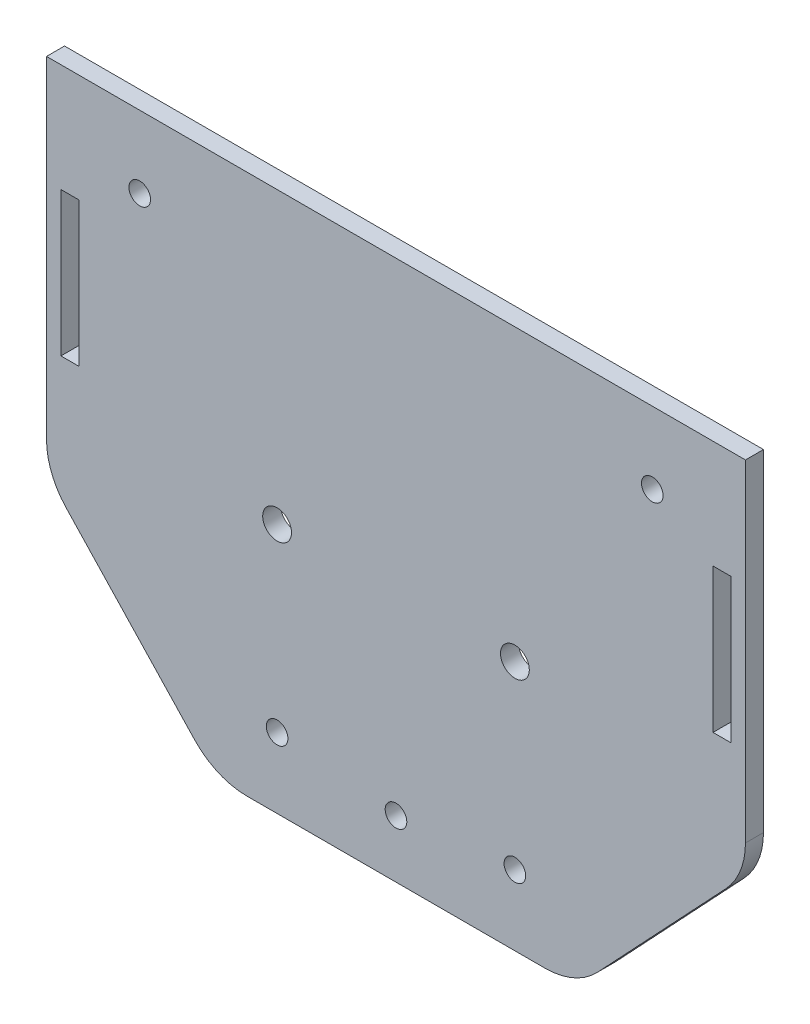
ISO-10303-21;
HEADER;
FILE_DESCRIPTION(('STEP AP214'),'2;1');
FILE_NAME('part.step','',(''),(''),'','','');
FILE_SCHEMA(('AUTOMOTIVE_DESIGN { 1 0 10303 214 1 1 1 1 }'));
ENDSEC;
DATA;
#1=APPLICATION_CONTEXT('core data for automotive mechanical design processes');
#2=APPLICATION_PROTOCOL_DEFINITION('international standard','automotive_design',2000,#1);
#3=PRODUCT_CONTEXT('',#1,'mechanical');
#4=PRODUCT('Part','Part','',(#3));
#5=PRODUCT_RELATED_PRODUCT_CATEGORY('part','',(#4));
#6=PRODUCT_DEFINITION_FORMATION('','',#4);
#7=PRODUCT_DEFINITION_CONTEXT('part definition',#1,'design');
#8=PRODUCT_DEFINITION('design','',#6,#7);
#9=PRODUCT_DEFINITION_SHAPE('','',#8);
#10=(LENGTH_UNIT() NAMED_UNIT(*) SI_UNIT(.MILLI.,.METRE.));
#11=(NAMED_UNIT(*) PLANE_ANGLE_UNIT() SI_UNIT($,.RADIAN.));
#12=(NAMED_UNIT(*) SI_UNIT($,.STERADIAN.) SOLID_ANGLE_UNIT());
#13=UNCERTAINTY_MEASURE_WITH_UNIT(LENGTH_MEASURE(1.E-05),#10,'distance_accuracy_value','');
#14=(GEOMETRIC_REPRESENTATION_CONTEXT(3) GLOBAL_UNCERTAINTY_ASSIGNED_CONTEXT((#13)) GLOBAL_UNIT_ASSIGNED_CONTEXT((#10,
#11,#12)) REPRESENTATION_CONTEXT('',''));
#15=CARTESIAN_POINT('',(0.,0.,0.));
#16=DIRECTION('',(0.,0.,1.));
#17=DIRECTION('',(1.,0.,0.));
#18=AXIS2_PLACEMENT_3D('',#15,#16,#17);
#19=CARTESIAN_POINT('',(-16.5,-2.74999999999998,1.25));
#20=DIRECTION('',(0.,0.,-1.));
#21=DIRECTION('',(-1.,0.,0.));
#22=AXIS2_PLACEMENT_3D('',#19,#20,#21);
#23=CYLINDRICAL_SURFACE('',#22,2.);
#24=CARTESIAN_POINT('',(-16.5,-2.74999999999998,1.25));
#25=DIRECTION('',(0.,0.,1.));
#26=DIRECTION('',(1.,0.,0.));
#27=AXIS2_PLACEMENT_3D('',#24,#25,#26);
#28=CIRCLE('',#27,2.);
#29=CARTESIAN_POINT('',(-14.5,-2.74999999999998,1.25));
#30=VERTEX_POINT('',#29);
#31=EDGE_CURVE('E310',#30,#30,#28,.T.);
#32=ORIENTED_EDGE('',*,*,#31,.T.);
#33=EDGE_LOOP('',(#32));
#34=FACE_BOUND('',#33,.T.);
#35=CARTESIAN_POINT('',(-16.5,-2.74999999999998,-1.25));
#36=DIRECTION('',(0.,0.,1.));
#37=DIRECTION('',(1.,0.,0.));
#38=AXIS2_PLACEMENT_3D('',#35,#36,#37);
#39=CIRCLE('',#38,2.);
#40=CARTESIAN_POINT('',(-14.5,-2.74999999999998,-1.25));
#41=VERTEX_POINT('',#40);
#42=EDGE_CURVE('E370',#41,#41,#39,.T.);
#43=ORIENTED_EDGE('',*,*,#42,.F.);
#44=EDGE_LOOP('',(#43));
#45=FACE_BOUND('',#44,.T.);
#46=ADVANCED_FACE('F121',(#34,#45),#23,.F.);
#47=CARTESIAN_POINT('',(35.5666666666667,27.5,1.25));
#48=DIRECTION('',(0.,0.,-1.));
#49=DIRECTION('',(-1.,0.,0.));
#50=AXIS2_PLACEMENT_3D('',#47,#48,#49);
#51=CYLINDRICAL_SURFACE('',#50,1.5);
#52=CARTESIAN_POINT('',(35.5666666666667,27.5,1.25));
#53=DIRECTION('',(0.,0.,1.));
#54=DIRECTION('',(1.,0.,0.));
#55=AXIS2_PLACEMENT_3D('',#52,#53,#54);
#56=CIRCLE('',#55,1.5);
#57=CARTESIAN_POINT('',(37.0666666666667,27.5,1.25));
#58=VERTEX_POINT('',#57);
#59=EDGE_CURVE('E307',#58,#58,#56,.F.);
#60=ORIENTED_EDGE('',*,*,#59,.F.);
#61=EDGE_LOOP('',(#60));
#62=FACE_BOUND('',#61,.T.);
#63=CARTESIAN_POINT('',(35.5666666666667,27.5,-1.25));
#64=DIRECTION('',(0.,0.,1.));
#65=DIRECTION('',(1.,0.,0.));
#66=AXIS2_PLACEMENT_3D('',#63,#64,#65);
#67=CIRCLE('',#66,1.5);
#68=CARTESIAN_POINT('',(37.0666666666667,27.5,-1.25));
#69=VERTEX_POINT('',#68);
#70=EDGE_CURVE('E367',#69,#69,#67,.F.);
#71=ORIENTED_EDGE('',*,*,#70,.T.);
#72=EDGE_LOOP('',(#71));
#73=FACE_BOUND('',#72,.T.);
#74=ADVANCED_FACE('F473',(#62,#73),#51,.F.);
#75=CARTESIAN_POINT('',(-35.5666666666667,27.5,1.25));
#76=DIRECTION('',(0.,0.,-1.));
#77=DIRECTION('',(-1.,0.,0.));
#78=AXIS2_PLACEMENT_3D('',#75,#76,#77);
#79=CYLINDRICAL_SURFACE('',#78,1.5);
#80=CARTESIAN_POINT('',(-35.5666666666667,27.5,1.25));
#81=DIRECTION('',(0.,0.,1.));
#82=DIRECTION('',(1.,0.,0.));
#83=AXIS2_PLACEMENT_3D('',#80,#81,#82);
#84=CIRCLE('',#83,1.5);
#85=CARTESIAN_POINT('',(-34.0666666666667,27.5,1.25));
#86=VERTEX_POINT('',#85);
#87=EDGE_CURVE('E304',#86,#86,#84,.T.);
#88=ORIENTED_EDGE('',*,*,#87,.T.);
#89=EDGE_LOOP('',(#88));
#90=FACE_BOUND('',#89,.T.);
#91=CARTESIAN_POINT('',(-35.5666666666667,27.5,-1.25));
#92=DIRECTION('',(0.,0.,1.));
#93=DIRECTION('',(1.,0.,0.));
#94=AXIS2_PLACEMENT_3D('',#91,#92,#93);
#95=CIRCLE('',#94,1.5);
#96=CARTESIAN_POINT('',(-34.0666666666667,27.5,-1.25));
#97=VERTEX_POINT('',#96);
#98=EDGE_CURVE('E364',#97,#97,#95,.T.);
#99=ORIENTED_EDGE('',*,*,#98,.F.);
#100=EDGE_LOOP('',(#99));
#101=FACE_BOUND('',#100,.T.);
#102=ADVANCED_FACE('F479',(#90,#101),#79,.F.);
#103=CARTESIAN_POINT('',(-44.,0.,1.25));
#104=DIRECTION('',(1.,0.,0.));
#105=DIRECTION('',(0.,1.,0.));
#106=AXIS2_PLACEMENT_3D('',#103,#104,#105);
#107=PLANE('',#106);
#108=DIRECTION('',(0.,-1.,0.));
#109=VECTOR('',#108,1.);
#110=CARTESIAN_POINT('',(-44.,0.,-1.25));
#111=LINE('',#110,#109);
#112=CARTESIAN_POINT('',(-44.,22.5,-1.25));
#113=VERTEX_POINT('',#112);
#114=CARTESIAN_POINT('',(-44.,2.50000000000001,-1.25));
#115=VERTEX_POINT('',#114);
#116=EDGE_CURVE('E355',#113,#115,#111,.T.);
#117=ORIENTED_EDGE('',*,*,#116,.T.);
#118=DIRECTION('',(0.,0.,-1.));
#119=VECTOR('',#118,1.);
#120=CARTESIAN_POINT('',(-44.,2.50000000000001,1.25));
#121=LINE('',#120,#119);
#122=CARTESIAN_POINT('',(-44.,2.50000000000001,1.25));
#123=VERTEX_POINT('',#122);
#124=EDGE_CURVE('E379',#123,#115,#121,.T.);
#125=ORIENTED_EDGE('',*,*,#124,.F.);
#126=DIRECTION('',(0.,-1.,0.));
#127=VECTOR('',#126,1.);
#128=CARTESIAN_POINT('',(-44.,0.,1.25));
#129=LINE('',#128,#127);
#130=CARTESIAN_POINT('',(-44.,22.5,1.25));
#131=VERTEX_POINT('',#130);
#132=EDGE_CURVE('E296',#131,#123,#129,.T.);
#133=ORIENTED_EDGE('',*,*,#132,.F.);
#134=DIRECTION('',(0.,0.,-1.));
#135=VECTOR('',#134,1.);
#136=CARTESIAN_POINT('',(-44.,22.5,1.25));
#137=LINE('',#136,#135);
#138=EDGE_CURVE('E381',#131,#113,#137,.T.);
#139=ORIENTED_EDGE('',*,*,#138,.T.);
#140=EDGE_LOOP('',(#117,#125,#133,#139));
#141=FACE_BOUND('',#140,.T.);
#142=ADVANCED_FACE('F488',(#141),#107,.F.);
#143=CARTESIAN_POINT('',(0.,2.5000000000001,1.25));
#144=DIRECTION('',(0.,1.,0.));
#145=DIRECTION('',(-1.,0.,0.));
#146=AXIS2_PLACEMENT_3D('',#143,#144,#145);
#147=PLANE('',#146);
#148=DIRECTION('',(1.,0.,0.));
#149=VECTOR('',#148,1.);
#150=CARTESIAN_POINT('',(0.,2.5000000000001,-1.25));
#151=LINE('',#150,#149);
#152=CARTESIAN_POINT('',(-46.5,2.50000000000001,-1.25));
#153=VERTEX_POINT('',#152);
#154=EDGE_CURVE('E358',#153,#115,#151,.T.);
#155=ORIENTED_EDGE('',*,*,#154,.F.);
#156=DIRECTION('',(0.,0.,-1.));
#157=VECTOR('',#156,1.);
#158=CARTESIAN_POINT('',(-46.5,2.50000000000001,1.25));
#159=LINE('',#158,#157);
#160=CARTESIAN_POINT('',(-46.5,2.50000000000001,1.25));
#161=VERTEX_POINT('',#160);
#162=EDGE_CURVE('E376',#161,#153,#159,.T.);
#163=ORIENTED_EDGE('',*,*,#162,.F.);
#164=DIRECTION('',(1.,0.,0.));
#165=VECTOR('',#164,1.);
#166=CARTESIAN_POINT('',(0.,2.5000000000001,1.25));
#167=LINE('',#166,#165);
#168=EDGE_CURVE('E298',#161,#123,#167,.T.);
#169=ORIENTED_EDGE('',*,*,#168,.T.);
#170=ORIENTED_EDGE('',*,*,#124,.T.);
#171=EDGE_LOOP('',(#155,#163,#169,#170));
#172=FACE_BOUND('',#171,.T.);
#173=ADVANCED_FACE('F493',(#172),#147,.T.);
#174=CARTESIAN_POINT('',(-46.5,0.,1.25));
#175=DIRECTION('',(1.,0.,0.));
#176=DIRECTION('',(0.,0.,-1.));
#177=AXIS2_PLACEMENT_3D('',#174,#175,#176);
#178=PLANE('',#177);
#179=DIRECTION('',(0.,-1.,0.));
#180=VECTOR('',#179,1.);
#181=CARTESIAN_POINT('',(-46.5,0.,-1.25));
#182=LINE('',#181,#180);
#183=CARTESIAN_POINT('',(-46.5,22.5,-1.25));
#184=VERTEX_POINT('',#183);
#185=EDGE_CURVE('E361',#184,#153,#182,.T.);
#186=ORIENTED_EDGE('',*,*,#185,.F.);
#187=DIRECTION('',(0.,0.,-1.));
#188=VECTOR('',#187,1.);
#189=CARTESIAN_POINT('',(-46.5,22.5,1.25));
#190=LINE('',#189,#188);
#191=CARTESIAN_POINT('',(-46.5,22.5,1.25));
#192=VERTEX_POINT('',#191);
#193=EDGE_CURVE('E374',#192,#184,#190,.T.);
#194=ORIENTED_EDGE('',*,*,#193,.F.);
#195=DIRECTION('',(0.,-1.,0.));
#196=VECTOR('',#195,1.);
#197=CARTESIAN_POINT('',(-46.5,0.,1.25));
#198=LINE('',#197,#196);
#199=EDGE_CURVE('E301',#192,#161,#198,.T.);
#200=ORIENTED_EDGE('',*,*,#199,.T.);
#201=ORIENTED_EDGE('',*,*,#162,.T.);
#202=EDGE_LOOP('',(#186,#194,#200,#201));
#203=FACE_BOUND('',#202,.T.);
#204=ADVANCED_FACE('F490',(#203),#178,.T.);
#205=CARTESIAN_POINT('',(1.87350135405492E-13,22.4999999999996,1.25));
#206=DIRECTION('',(0.,1.,0.));
#207=DIRECTION('',(-1.,0.,0.));
#208=AXIS2_PLACEMENT_3D('',#205,#206,#207);
#209=PLANE('',#208);
#210=DIRECTION('',(1.,0.,0.));
#211=VECTOR('',#210,1.);
#212=CARTESIAN_POINT('',(1.87350135405492E-13,22.4999999999996,-1.25));
#213=LINE('',#212,#211);
#214=EDGE_CURVE('E352',#184,#113,#213,.T.);
#215=ORIENTED_EDGE('',*,*,#214,.T.);
#216=ORIENTED_EDGE('',*,*,#138,.F.);
#217=DIRECTION('',(1.,0.,0.));
#218=VECTOR('',#217,1.);
#219=CARTESIAN_POINT('',(1.87350135405492E-13,22.4999999999996,1.25));
#220=LINE('',#219,#218);
#221=EDGE_CURVE('E293',#192,#131,#220,.T.);
#222=ORIENTED_EDGE('',*,*,#221,.F.);
#223=ORIENTED_EDGE('',*,*,#193,.T.);
#224=EDGE_LOOP('',(#215,#216,#222,#223));
#225=FACE_BOUND('',#224,.T.);
#226=ADVANCED_FACE('F470',(#225),#209,.F.);
#227=CARTESIAN_POINT('',(0.,37.5,1.25));
#228=DIRECTION('',(0.,-1.,0.));
#229=DIRECTION('',(0.,0.,-1.));
#230=AXIS2_PLACEMENT_3D('',#227,#228,#229);
#231=PLANE('',#230);
#232=DIRECTION('',(-1.,0.,0.));
#233=VECTOR('',#232,1.);
#234=CARTESIAN_POINT('',(0.,37.5,-1.25));
#235=LINE('',#234,#233);
#236=CARTESIAN_POINT('',(48.5,37.5,-1.25));
#237=VERTEX_POINT('',#236);
#238=CARTESIAN_POINT('',(-48.5,37.5,-1.25));
#239=VERTEX_POINT('',#238);
#240=EDGE_CURVE('E338',#237,#239,#235,.T.);
#241=ORIENTED_EDGE('',*,*,#240,.T.);
#242=DIRECTION('',(0.,0.,-1.));
#243=VECTOR('',#242,1.);
#244=CARTESIAN_POINT('',(-48.5,37.5,1.25));
#245=LINE('',#244,#243);
#246=CARTESIAN_POINT('',(-48.5,37.5,1.25));
#247=VERTEX_POINT('',#246);
#248=EDGE_CURVE('E257',#247,#239,#245,.T.);
#249=ORIENTED_EDGE('',*,*,#248,.F.);
#250=DIRECTION('',(-1.,0.,0.));
#251=VECTOR('',#250,1.);
#252=CARTESIAN_POINT('',(0.,37.5,1.25));
#253=LINE('',#252,#251);
#254=CARTESIAN_POINT('',(48.5,37.5,1.25));
#255=VERTEX_POINT('',#254);
#256=EDGE_CURVE('E280',#255,#247,#253,.T.);
#257=ORIENTED_EDGE('',*,*,#256,.F.);
#258=DIRECTION('',(0.,0.,-1.));
#259=VECTOR('',#258,1.);
#260=CARTESIAN_POINT('',(48.5,37.5,1.25));
#261=LINE('',#260,#259);
#262=EDGE_CURVE('E377',#255,#237,#261,.T.);
#263=ORIENTED_EDGE('',*,*,#262,.T.);
#264=EDGE_LOOP('',(#241,#249,#257,#263));
#265=FACE_BOUND('',#264,.T.);
#266=ADVANCED_FACE('F457',(#265),#231,.F.);
#267=CARTESIAN_POINT('',(-48.5,0.,1.25));
#268=DIRECTION('',(1.,0.,0.));
#269=DIRECTION('',(0.,1.,0.));
#270=AXIS2_PLACEMENT_3D('',#267,#268,#269);
#271=PLANE('',#270);
#272=DIRECTION('',(0.,-1.,0.));
#273=VECTOR('',#272,1.);
#274=CARTESIAN_POINT('',(-48.5,0.,-1.25));
#275=LINE('',#274,#273);
#276=CARTESIAN_POINT('',(-48.5,-8.53783960485294,-1.25));
#277=VERTEX_POINT('',#276);
#278=EDGE_CURVE('E341',#239,#277,#275,.T.);
#279=ORIENTED_EDGE('',*,*,#278,.T.);
#280=DIRECTION('',(0.,0.,-1.));
#281=VECTOR('',#280,1.);
#282=CARTESIAN_POINT('',(-48.5,-8.53783960485294,1.25));
#283=LINE('',#282,#281);
#284=CARTESIAN_POINT('',(-48.5,-8.53783960485294,1.25));
#285=VERTEX_POINT('',#284);
#286=EDGE_CURVE('E12',#277,#285,#283,.F.);
#287=ORIENTED_EDGE('',*,*,#286,.T.);
#288=DIRECTION('',(0.,-1.,0.));
#289=VECTOR('',#288,1.);
#290=CARTESIAN_POINT('',(-48.5,0.,1.25));
#291=LINE('',#290,#289);
#292=EDGE_CURVE('E283',#247,#285,#291,.T.);
#293=ORIENTED_EDGE('',*,*,#292,.F.);
#294=ORIENTED_EDGE('',*,*,#248,.T.);
#295=EDGE_LOOP('',(#279,#287,#293,#294));
#296=FACE_BOUND('',#295,.T.);
#297=ADVANCED_FACE('F462',(#296),#271,.F.);
#298=CARTESIAN_POINT('',(-31.9866213633468,-30.067424081546,1.25));
#299=DIRECTION('',(0.728627668902007,0.684910008767887,0.));
#300=DIRECTION('',(-0.684910008767887,0.728627668902007,0.));
#301=AXIS2_PLACEMENT_3D('',#298,#299,#300);
#302=PLANE('',#301);
#303=DIRECTION('',(0.684910008767887,-0.728627668902007,0.));
#304=VECTOR('',#303,1.);
#305=CARTESIAN_POINT('',(-31.9866213633468,-30.067424081546,-1.25));
#306=LINE('',#305,#304);
#307=CARTESIAN_POINT('',(-45.7862766890201,-15.3869396925318,-1.25));
#308=VERTEX_POINT('',#307);
#309=CARTESIAN_POINT('',(-27.9618459175818,-34.3491000876789,-1.25));
#310=VERTEX_POINT('',#309);
#311=EDGE_CURVE('E344',#308,#310,#306,.T.);
#312=ORIENTED_EDGE('',*,*,#311,.T.);
#313=DIRECTION('',(0.,0.,-1.));
#314=VECTOR('',#313,1.);
#315=CARTESIAN_POINT('',(-27.9618459175819,-34.3491000876789,1.25));
#316=LINE('',#315,#314);
#317=CARTESIAN_POINT('',(-27.9618459175818,-34.3491000876789,1.25));
#318=VERTEX_POINT('',#317);
#319=EDGE_CURVE('E129',#310,#318,#316,.F.);
#320=ORIENTED_EDGE('',*,*,#319,.T.);
#321=DIRECTION('',(0.684910008767887,-0.728627668902007,0.));
#322=VECTOR('',#321,1.);
#323=CARTESIAN_POINT('',(-31.9866213633468,-30.067424081546,1.25));
#324=LINE('',#323,#322);
#325=CARTESIAN_POINT('',(-45.7862766890201,-15.3869396925318,1.25));
#326=VERTEX_POINT('',#325);
#327=EDGE_CURVE('E286',#326,#318,#324,.T.);
#328=ORIENTED_EDGE('',*,*,#327,.F.);
#329=DIRECTION('',(0.,0.,-1.));
#330=VECTOR('',#329,1.);
#331=CARTESIAN_POINT('',(-45.7862766890201,-15.3869396925318,1.25));
#332=LINE('',#331,#330);
#333=EDGE_CURVE('E419',#326,#308,#332,.T.);
#334=ORIENTED_EDGE('',*,*,#333,.T.);
#335=EDGE_LOOP('',(#312,#320,#328,#334));
#336=FACE_BOUND('',#335,.T.);
#337=ADVANCED_FACE('F424',(#336),#302,.F.);
#338=CARTESIAN_POINT('',(0.,-37.5,1.25));
#339=DIRECTION('',(0.,1.,0.));
#340=DIRECTION('',(-1.,0.,0.));
#341=AXIS2_PLACEMENT_3D('',#338,#339,#340);
#342=PLANE('',#341);
#343=DIRECTION('',(1.,0.,0.));
#344=VECTOR('',#343,1.);
#345=CARTESIAN_POINT('',(0.,-37.5,-1.25));
#346=LINE('',#345,#344);
#347=CARTESIAN_POINT('',(-20.6755692285618,-37.5,-1.25));
#348=VERTEX_POINT('',#347);
#349=CARTESIAN_POINT('',(20.6755692285618,-37.5,-1.25));
#350=VERTEX_POINT('',#349);
#351=EDGE_CURVE('E347',#348,#350,#346,.T.);
#352=ORIENTED_EDGE('',*,*,#351,.T.);
#353=DIRECTION('',(0.,0.,-1.));
#354=VECTOR('',#353,1.);
#355=CARTESIAN_POINT('',(20.6755692285618,-37.5,1.25));
#356=LINE('',#355,#354);
#357=CARTESIAN_POINT('',(20.6755692285618,-37.5,1.25));
#358=VERTEX_POINT('',#357);
#359=EDGE_CURVE('E136',#350,#358,#356,.F.);
#360=ORIENTED_EDGE('',*,*,#359,.T.);
#361=DIRECTION('',(1.,0.,0.));
#362=VECTOR('',#361,1.);
#363=CARTESIAN_POINT('',(0.,-37.5,1.25));
#364=LINE('',#363,#362);
#365=CARTESIAN_POINT('',(-20.6755692285618,-37.5,1.25));
#366=VERTEX_POINT('',#365);
#367=EDGE_CURVE('E288',#366,#358,#364,.T.);
#368=ORIENTED_EDGE('',*,*,#367,.F.);
#369=DIRECTION('',(0.,0.,-1.));
#370=VECTOR('',#369,1.);
#371=CARTESIAN_POINT('',(-20.6755692285618,-37.5,1.25));
#372=LINE('',#371,#370);
#373=EDGE_CURVE('E415',#366,#348,#372,.T.);
#374=ORIENTED_EDGE('',*,*,#373,.T.);
#375=EDGE_LOOP('',(#352,#360,#368,#374));
#376=FACE_BOUND('',#375,.T.);
#377=ADVANCED_FACE('F434',(#376),#342,.F.);
#378=CARTESIAN_POINT('',(31.9866213633468,-30.067424081546,1.25));
#379=DIRECTION('',(0.728627668902007,-0.684910008767887,0.));
#380=DIRECTION('',(0.684910008767887,0.728627668902007,0.));
#381=AXIS2_PLACEMENT_3D('',#378,#379,#380);
#382=PLANE('',#381);
#383=DIRECTION('',(-0.684910008767887,-0.728627668902007,0.));
#384=VECTOR('',#383,1.);
#385=CARTESIAN_POINT('',(31.9866213633468,-30.067424081546,-1.25));
#386=LINE('',#385,#384);
#387=CARTESIAN_POINT('',(45.7862766890201,-15.3869396925318,-1.25));
#388=VERTEX_POINT('',#387);
#389=CARTESIAN_POINT('',(27.9618459175819,-34.3491000876788,-1.25));
#390=VERTEX_POINT('',#389);
#391=EDGE_CURVE('E349',#388,#390,#386,.T.);
#392=ORIENTED_EDGE('',*,*,#391,.F.);
#393=DIRECTION('',(0.,0.,-1.));
#394=VECTOR('',#393,1.);
#395=CARTESIAN_POINT('',(45.7862766890201,-15.3869396925318,1.25));
#396=LINE('',#395,#394);
#397=CARTESIAN_POINT('',(45.7862766890201,-15.3869396925318,1.25));
#398=VERTEX_POINT('',#397);
#399=EDGE_CURVE('E406',#388,#398,#396,.F.);
#400=ORIENTED_EDGE('',*,*,#399,.T.);
#401=DIRECTION('',(-0.684910008767887,-0.728627668902007,0.));
#402=VECTOR('',#401,1.);
#403=CARTESIAN_POINT('',(31.9866213633468,-30.067424081546,1.25));
#404=LINE('',#403,#402);
#405=CARTESIAN_POINT('',(27.9618459175819,-34.3491000876788,1.25));
#406=VERTEX_POINT('',#405);
#407=EDGE_CURVE('E290',#398,#406,#404,.T.);
#408=ORIENTED_EDGE('',*,*,#407,.T.);
#409=DIRECTION('',(0.,0.,-1.));
#410=VECTOR('',#409,1.);
#411=CARTESIAN_POINT('',(27.9618459175819,-34.3491000876788,-1.25));
#412=LINE('',#411,#410);
#413=EDGE_CURVE('E403',#406,#390,#412,.T.);
#414=ORIENTED_EDGE('',*,*,#413,.T.);
#415=EDGE_LOOP('',(#392,#400,#408,#414));
#416=FACE_BOUND('',#415,.T.);
#417=ADVANCED_FACE('F444',(#416),#382,.T.);
#418=CARTESIAN_POINT('',(48.5,0.,1.25));
#419=DIRECTION('',(1.,0.,0.));
#420=DIRECTION('',(0.,1.,0.));
#421=AXIS2_PLACEMENT_3D('',#418,#419,#420);
#422=PLANE('',#421);
#423=DIRECTION('',(0.,-1.,0.));
#424=VECTOR('',#423,1.);
#425=CARTESIAN_POINT('',(48.5,0.,1.25));
#426=LINE('',#425,#424);
#427=CARTESIAN_POINT('',(48.5,-8.53783960485296,1.25));
#428=VERTEX_POINT('',#427);
#429=EDGE_CURVE('E277',#255,#428,#426,.T.);
#430=ORIENTED_EDGE('',*,*,#429,.T.);
#431=DIRECTION('',(0.,0.,-1.));
#432=VECTOR('',#431,1.);
#433=CARTESIAN_POINT('',(48.5,-8.53783960485296,1.25));
#434=LINE('',#433,#432);
#435=CARTESIAN_POINT('',(48.5,-8.53783960485296,-1.25));
#436=VERTEX_POINT('',#435);
#437=EDGE_CURVE('E384',#428,#436,#434,.T.);
#438=ORIENTED_EDGE('',*,*,#437,.T.);
#439=DIRECTION('',(0.,-1.,0.));
#440=VECTOR('',#439,1.);
#441=CARTESIAN_POINT('',(48.5,0.,-1.25));
#442=LINE('',#441,#440);
#443=EDGE_CURVE('E335',#237,#436,#442,.T.);
#444=ORIENTED_EDGE('',*,*,#443,.F.);
#445=ORIENTED_EDGE('',*,*,#262,.F.);
#446=EDGE_LOOP('',(#430,#438,#444,#445));
#447=FACE_BOUND('',#446,.T.);
#448=ADVANCED_FACE('F453',(#447),#422,.T.);
#449=CARTESIAN_POINT('',(-1.87350135405493E-13,22.4999999999996,1.25));
#450=DIRECTION('',(0.,-1.,0.));
#451=DIRECTION('',(1.,0.,0.));
#452=AXIS2_PLACEMENT_3D('',#449,#450,#451);
#453=PLANE('',#452);
#454=DIRECTION('',(-1.,0.,0.));
#455=VECTOR('',#454,1.);
#456=CARTESIAN_POINT('',(-1.87350135405493E-13,22.4999999999996,-1.25));
#457=LINE('',#456,#455);
#458=CARTESIAN_POINT('',(46.5,22.5,-1.25));
#459=VERTEX_POINT('',#458);
#460=CARTESIAN_POINT('',(44.,22.5,-1.25));
#461=VERTEX_POINT('',#460);
#462=EDGE_CURVE('E327',#459,#461,#457,.T.);
#463=ORIENTED_EDGE('',*,*,#462,.F.);
#464=DIRECTION('',(0.,0.,-1.));
#465=VECTOR('',#464,1.);
#466=CARTESIAN_POINT('',(46.5,22.5,1.25));
#467=LINE('',#466,#465);
#468=CARTESIAN_POINT('',(46.5,22.5,1.25));
#469=VERTEX_POINT('',#468);
#470=EDGE_CURVE('E258',#469,#459,#467,.T.);
#471=ORIENTED_EDGE('',*,*,#470,.F.);
#472=DIRECTION('',(-1.,0.,0.));
#473=VECTOR('',#472,1.);
#474=CARTESIAN_POINT('',(-1.87350135405493E-13,22.4999999999996,1.25));
#475=LINE('',#474,#473);
#476=CARTESIAN_POINT('',(44.,22.5,1.25));
#477=VERTEX_POINT('',#476);
#478=EDGE_CURVE('E264',#469,#477,#475,.T.);
#479=ORIENTED_EDGE('',*,*,#478,.T.);
#480=DIRECTION('',(0.,0.,-1.));
#481=VECTOR('',#480,1.);
#482=CARTESIAN_POINT('',(44.,22.5,1.25));
#483=LINE('',#482,#481);
#484=EDGE_CURVE('E247',#477,#461,#483,.T.);
#485=ORIENTED_EDGE('',*,*,#484,.T.);
#486=EDGE_LOOP('',(#463,#471,#479,#485));
#487=FACE_BOUND('',#486,.T.);
#488=ADVANCED_FACE('F269',(#487),#453,.T.);
#489=CARTESIAN_POINT('',(46.5,0.,1.25));
#490=DIRECTION('',(1.,0.,0.));
#491=DIRECTION('',(0.,0.,-1.));
#492=AXIS2_PLACEMENT_3D('',#489,#490,#491);
#493=PLANE('',#492);
#494=DIRECTION('',(0.,-1.,0.));
#495=VECTOR('',#494,1.);
#496=CARTESIAN_POINT('',(46.5,0.,-1.25));
#497=LINE('',#496,#495);
#498=CARTESIAN_POINT('',(46.5,2.5,-1.25));
#499=VERTEX_POINT('',#498);
#500=EDGE_CURVE('E329',#459,#499,#497,.T.);
#501=ORIENTED_EDGE('',*,*,#500,.T.);
#502=DIRECTION('',(0.,0.,-1.));
#503=VECTOR('',#502,1.);
#504=CARTESIAN_POINT('',(46.5,2.5,1.25));
#505=LINE('',#504,#503);
#506=CARTESIAN_POINT('',(46.5,2.5,1.25));
#507=VERTEX_POINT('',#506);
#508=EDGE_CURVE('E389',#507,#499,#505,.T.);
#509=ORIENTED_EDGE('',*,*,#508,.F.);
#510=DIRECTION('',(0.,-1.,0.));
#511=VECTOR('',#510,1.);
#512=CARTESIAN_POINT('',(46.5,0.,1.25));
#513=LINE('',#512,#511);
#514=EDGE_CURVE('E271',#469,#507,#513,.T.);
#515=ORIENTED_EDGE('',*,*,#514,.F.);
#516=ORIENTED_EDGE('',*,*,#470,.T.);
#517=EDGE_LOOP('',(#501,#509,#515,#516));
#518=FACE_BOUND('',#517,.T.);
#519=ADVANCED_FACE('F528',(#518),#493,.F.);
#520=CARTESIAN_POINT('',(0.,2.50000000000038,1.25));
#521=DIRECTION('',(0.,-1.,0.));
#522=DIRECTION('',(1.,0.,0.));
#523=AXIS2_PLACEMENT_3D('',#520,#521,#522);
#524=PLANE('',#523);
#525=DIRECTION('',(-1.,0.,0.));
#526=VECTOR('',#525,1.);
#527=CARTESIAN_POINT('',(0.,2.50000000000038,-1.25));
#528=LINE('',#527,#526);
#529=CARTESIAN_POINT('',(44.,2.50000000000002,-1.25));
#530=VERTEX_POINT('',#529);
#531=EDGE_CURVE('E332',#499,#530,#528,.T.);
#532=ORIENTED_EDGE('',*,*,#531,.T.);
#533=DIRECTION('',(0.,0.,-1.));
#534=VECTOR('',#533,1.);
#535=CARTESIAN_POINT('',(44.,2.50000000000002,1.25));
#536=LINE('',#535,#534);
#537=CARTESIAN_POINT('',(44.,2.50000000000002,1.25));
#538=VERTEX_POINT('',#537);
#539=EDGE_CURVE('E313',#538,#530,#536,.T.);
#540=ORIENTED_EDGE('',*,*,#539,.F.);
#541=DIRECTION('',(-1.,0.,0.));
#542=VECTOR('',#541,1.);
#543=CARTESIAN_POINT('',(0.,2.50000000000038,1.25));
#544=LINE('',#543,#542);
#545=EDGE_CURVE('E265',#507,#538,#544,.T.);
#546=ORIENTED_EDGE('',*,*,#545,.F.);
#547=ORIENTED_EDGE('',*,*,#508,.T.);
#548=EDGE_LOOP('',(#532,#540,#546,#547));
#549=FACE_BOUND('',#548,.T.);
#550=ADVANCED_FACE('F536',(#549),#524,.F.);
#551=CARTESIAN_POINT('',(44.,0.,1.25));
#552=DIRECTION('',(1.,0.,0.));
#553=DIRECTION('',(0.,0.,-1.));
#554=AXIS2_PLACEMENT_3D('',#551,#552,#553);
#555=PLANE('',#554);
#556=DIRECTION('',(0.,-1.,0.));
#557=VECTOR('',#556,1.);
#558=CARTESIAN_POINT('',(44.,0.,-1.25));
#559=LINE('',#558,#557);
#560=EDGE_CURVE('E252',#461,#530,#559,.T.);
#561=ORIENTED_EDGE('',*,*,#560,.F.);
#562=ORIENTED_EDGE('',*,*,#484,.F.);
#563=DIRECTION('',(0.,-1.,0.));
#564=VECTOR('',#563,1.);
#565=CARTESIAN_POINT('',(44.,0.,1.25));
#566=LINE('',#565,#564);
#567=EDGE_CURVE('E250',#477,#538,#566,.T.);
#568=ORIENTED_EDGE('',*,*,#567,.T.);
#569=ORIENTED_EDGE('',*,*,#539,.T.);
#570=EDGE_LOOP('',(#561,#562,#568,#569));
#571=FACE_BOUND('',#570,.T.);
#572=ADVANCED_FACE('F249',(#571),#555,.T.);
#573=CARTESIAN_POINT('',(0.,-29.5,1.25));
#574=DIRECTION('',(0.,0.,-1.));
#575=DIRECTION('',(-1.,0.,0.));
#576=AXIS2_PLACEMENT_3D('',#573,#574,#575);
#577=CYLINDRICAL_SURFACE('',#576,1.5);
#578=CARTESIAN_POINT('',(0.,-29.5,1.25));
#579=DIRECTION('',(0.,0.,1.));
#580=DIRECTION('',(1.,0.,0.));
#581=AXIS2_PLACEMENT_3D('',#578,#579,#580);
#582=CIRCLE('',#581,1.5);
#583=CARTESIAN_POINT('',(1.5,-29.5,1.25));
#584=VERTEX_POINT('',#583);
#585=EDGE_CURVE('E267',#584,#584,#582,.T.);
#586=ORIENTED_EDGE('',*,*,#585,.T.);
#587=EDGE_LOOP('',(#586));
#588=FACE_BOUND('',#587,.T.);
#589=CARTESIAN_POINT('',(0.,-29.5,-1.25));
#590=DIRECTION('',(0.,0.,1.));
#591=DIRECTION('',(1.,0.,0.));
#592=AXIS2_PLACEMENT_3D('',#589,#590,#591);
#593=CIRCLE('',#592,1.5);
#594=CARTESIAN_POINT('',(1.5,-29.5,-1.25));
#595=VERTEX_POINT('',#594);
#596=EDGE_CURVE('E323',#595,#595,#593,.T.);
#597=ORIENTED_EDGE('',*,*,#596,.F.);
#598=EDGE_LOOP('',(#597));
#599=FACE_BOUND('',#598,.T.);
#600=ADVANCED_FACE('F551',(#588,#599),#577,.F.);
#601=CARTESIAN_POINT('',(-16.5,-27.75,1.25));
#602=DIRECTION('',(0.,0.,-1.));
#603=DIRECTION('',(-1.,0.,0.));
#604=AXIS2_PLACEMENT_3D('',#601,#602,#603);
#605=CYLINDRICAL_SURFACE('',#604,1.5);
#606=CARTESIAN_POINT('',(-16.5,-27.75,1.25));
#607=DIRECTION('',(0.,0.,1.));
#608=DIRECTION('',(1.,0.,0.));
#609=AXIS2_PLACEMENT_3D('',#606,#607,#608);
#610=CIRCLE('',#609,1.5);
#611=CARTESIAN_POINT('',(-15.,-27.75,1.25));
#612=VERTEX_POINT('',#611);
#613=EDGE_CURVE('E745',#612,#612,#610,.T.);
#614=ORIENTED_EDGE('',*,*,#613,.T.);
#615=EDGE_LOOP('',(#614));
#616=FACE_BOUND('',#615,.T.);
#617=CARTESIAN_POINT('',(-16.5,-27.75,-1.25));
#618=DIRECTION('',(0.,0.,1.));
#619=DIRECTION('',(1.,0.,0.));
#620=AXIS2_PLACEMENT_3D('',#617,#618,#619);
#621=CIRCLE('',#620,1.5);
#622=CARTESIAN_POINT('',(-15.,-27.75,-1.25));
#623=VERTEX_POINT('',#622);
#624=EDGE_CURVE('E320',#623,#623,#621,.T.);
#625=ORIENTED_EDGE('',*,*,#624,.F.);
#626=EDGE_LOOP('',(#625));
#627=FACE_BOUND('',#626,.T.);
#628=ADVANCED_FACE('F558',(#616,#627),#605,.F.);
#629=CARTESIAN_POINT('',(16.5,-27.75,1.25));
#630=DIRECTION('',(0.,0.,-1.));
#631=DIRECTION('',(-1.,0.,0.));
#632=AXIS2_PLACEMENT_3D('',#629,#630,#631);
#633=CYLINDRICAL_SURFACE('',#632,1.5);
#634=CARTESIAN_POINT('',(16.5,-27.75,1.25));
#635=DIRECTION('',(0.,0.,1.));
#636=DIRECTION('',(1.,0.,0.));
#637=AXIS2_PLACEMENT_3D('',#634,#635,#636);
#638=CIRCLE('',#637,1.5);
#639=CARTESIAN_POINT('',(18.,-27.75,1.25));
#640=VERTEX_POINT('',#639);
#641=EDGE_CURVE('E741',#640,#640,#638,.F.);
#642=ORIENTED_EDGE('',*,*,#641,.F.);
#643=EDGE_LOOP('',(#642));
#644=FACE_BOUND('',#643,.T.);
#645=CARTESIAN_POINT('',(16.5,-27.75,-1.25));
#646=DIRECTION('',(0.,0.,1.));
#647=DIRECTION('',(1.,0.,0.));
#648=AXIS2_PLACEMENT_3D('',#645,#646,#647);
#649=CIRCLE('',#648,1.5);
#650=CARTESIAN_POINT('',(18.,-27.75,-1.25));
#651=VERTEX_POINT('',#650);
#652=EDGE_CURVE('E317',#651,#651,#649,.F.);
#653=ORIENTED_EDGE('',*,*,#652,.T.);
#654=EDGE_LOOP('',(#653));
#655=FACE_BOUND('',#654,.T.);
#656=ADVANCED_FACE('F566',(#644,#655),#633,.F.);
#657=CARTESIAN_POINT('',(16.5,-2.74999999999997,1.25));
#658=DIRECTION('',(0.,0.,-1.));
#659=DIRECTION('',(-1.,0.,0.));
#660=AXIS2_PLACEMENT_3D('',#657,#658,#659);
#661=CYLINDRICAL_SURFACE('',#660,2.);
#662=CARTESIAN_POINT('',(16.5,-2.74999999999997,1.25));
#663=DIRECTION('',(0.,0.,1.));
#664=DIRECTION('',(1.,0.,0.));
#665=AXIS2_PLACEMENT_3D('',#662,#663,#664);
#666=CIRCLE('',#665,2.);
#667=CARTESIAN_POINT('',(18.5,-2.74999999999997,1.25));
#668=VERTEX_POINT('',#667);
#669=EDGE_CURVE('E373',#668,#668,#666,.T.);
#670=ORIENTED_EDGE('',*,*,#669,.T.);
#671=EDGE_LOOP('',(#670));
#672=FACE_BOUND('',#671,.T.);
#673=CARTESIAN_POINT('',(16.5,-2.74999999999997,-1.25));
#674=DIRECTION('',(0.,0.,1.));
#675=DIRECTION('',(1.,0.,0.));
#676=AXIS2_PLACEMENT_3D('',#673,#674,#675);
#677=CIRCLE('',#676,2.);
#678=CARTESIAN_POINT('',(18.5,-2.74999999999997,-1.25));
#679=VERTEX_POINT('',#678);
#680=EDGE_CURVE('E314',#679,#679,#677,.T.);
#681=ORIENTED_EDGE('',*,*,#680,.F.);
#682=EDGE_LOOP('',(#681));
#683=FACE_BOUND('',#682,.T.);
#684=ADVANCED_FACE('F574',(#672,#683),#661,.F.);
#685=CARTESIAN_POINT('',(0.,0.,-1.25));
#686=DIRECTION('',(0.,0.,1.));
#687=DIRECTION('',(1.,0.,0.));
#688=AXIS2_PLACEMENT_3D('',#685,#686,#687);
#689=PLANE('',#688);
#690=ORIENTED_EDGE('',*,*,#680,.T.);
#691=EDGE_LOOP('',(#690));
#692=FACE_BOUND('',#691,.T.);
#693=ORIENTED_EDGE('',*,*,#652,.F.);
#694=EDGE_LOOP('',(#693));
#695=FACE_BOUND('',#694,.T.);
#696=ORIENTED_EDGE('',*,*,#624,.T.);
#697=EDGE_LOOP('',(#696));
#698=FACE_BOUND('',#697,.T.);
#699=ORIENTED_EDGE('',*,*,#596,.T.);
#700=EDGE_LOOP('',(#699));
#701=FACE_BOUND('',#700,.T.);
#702=ORIENTED_EDGE('',*,*,#560,.T.);
#703=ORIENTED_EDGE('',*,*,#531,.F.);
#704=ORIENTED_EDGE('',*,*,#500,.F.);
#705=ORIENTED_EDGE('',*,*,#462,.T.);
#706=EDGE_LOOP('',(#702,#703,#704,#705));
#707=FACE_BOUND('',#706,.T.);
#708=ORIENTED_EDGE('',*,*,#443,.T.);
#709=CARTESIAN_POINT('',(38.5,-8.53783960485295,-1.25));
#710=DIRECTION('',(0.,0.,1.));
#711=DIRECTION('',(1.,0.,0.));
#712=AXIS2_PLACEMENT_3D('',#709,#710,#711);
#713=CIRCLE('',#712,10.);
#714=EDGE_CURVE('E401',#436,#388,#713,.F.);
#715=ORIENTED_EDGE('',*,*,#714,.T.);
#716=ORIENTED_EDGE('',*,*,#391,.T.);
#717=CARTESIAN_POINT('',(20.6755692285618,-27.5,-1.25));
#718=DIRECTION('',(0.,0.,1.));
#719=DIRECTION('',(1.,0.,0.));
#720=AXIS2_PLACEMENT_3D('',#717,#718,#719);
#721=CIRCLE('',#720,10.);
#722=EDGE_CURVE('E399',#390,#350,#721,.F.);
#723=ORIENTED_EDGE('',*,*,#722,.T.);
#724=ORIENTED_EDGE('',*,*,#351,.F.);
#725=CARTESIAN_POINT('',(-20.6755692285618,-27.5,-1.25));
#726=DIRECTION('',(0.,0.,1.));
#727=DIRECTION('',(1.,0.,0.));
#728=AXIS2_PLACEMENT_3D('',#725,#726,#727);
#729=CIRCLE('',#728,10.);
#730=EDGE_CURVE('E397',#348,#310,#729,.F.);
#731=ORIENTED_EDGE('',*,*,#730,.T.);
#732=ORIENTED_EDGE('',*,*,#311,.F.);
#733=CARTESIAN_POINT('',(-38.5,-8.53783960485295,-1.25));
#734=DIRECTION('',(0.,0.,1.));
#735=DIRECTION('',(1.,0.,0.));
#736=AXIS2_PLACEMENT_3D('',#733,#734,#735);
#737=CIRCLE('',#736,10.);
#738=EDGE_CURVE('E395',#308,#277,#737,.F.);
#739=ORIENTED_EDGE('',*,*,#738,.T.);
#740=ORIENTED_EDGE('',*,*,#278,.F.);
#741=ORIENTED_EDGE('',*,*,#240,.F.);
#742=EDGE_LOOP('',(#708,#715,#716,#723,#724,#731,#732,#739,#740,#741));
#743=FACE_BOUND('',#742,.T.);
#744=ORIENTED_EDGE('',*,*,#214,.F.);
#745=ORIENTED_EDGE('',*,*,#185,.T.);
#746=ORIENTED_EDGE('',*,*,#154,.T.);
#747=ORIENTED_EDGE('',*,*,#116,.F.);
#748=EDGE_LOOP('',(#744,#745,#746,#747));
#749=FACE_BOUND('',#748,.T.);
#750=ORIENTED_EDGE('',*,*,#98,.T.);
#751=EDGE_LOOP('',(#750));
#752=FACE_BOUND('',#751,.T.);
#753=ORIENTED_EDGE('',*,*,#70,.F.);
#754=EDGE_LOOP('',(#753));
#755=FACE_BOUND('',#754,.T.);
#756=ORIENTED_EDGE('',*,*,#42,.T.);
#757=EDGE_LOOP('',(#756));
#758=FACE_BOUND('',#757,.T.);
#759=ADVANCED_FACE('F436',(#692,#695,#698,#701,#707,#743,#749,#752,#755,#758),#689,.F.);
#760=CARTESIAN_POINT('',(0.,0.,1.25));
#761=DIRECTION('',(0.,0.,1.));
#762=DIRECTION('',(1.,0.,0.));
#763=AXIS2_PLACEMENT_3D('',#760,#761,#762);
#764=PLANE('',#763);
#765=ORIENTED_EDGE('',*,*,#669,.F.);
#766=EDGE_LOOP('',(#765));
#767=FACE_BOUND('',#766,.T.);
#768=ORIENTED_EDGE('',*,*,#641,.T.);
#769=EDGE_LOOP('',(#768));
#770=FACE_BOUND('',#769,.T.);
#771=ORIENTED_EDGE('',*,*,#613,.F.);
#772=EDGE_LOOP('',(#771));
#773=FACE_BOUND('',#772,.T.);
#774=ORIENTED_EDGE('',*,*,#585,.F.);
#775=EDGE_LOOP('',(#774));
#776=FACE_BOUND('',#775,.T.);
#777=ORIENTED_EDGE('',*,*,#567,.F.);
#778=ORIENTED_EDGE('',*,*,#478,.F.);
#779=ORIENTED_EDGE('',*,*,#514,.T.);
#780=ORIENTED_EDGE('',*,*,#545,.T.);
#781=EDGE_LOOP('',(#777,#778,#779,#780));
#782=FACE_BOUND('',#781,.T.);
#783=ORIENTED_EDGE('',*,*,#407,.F.);
#784=CARTESIAN_POINT('',(38.5,-8.53783960485295,1.25));
#785=DIRECTION('',(0.,0.,1.));
#786=DIRECTION('',(1.,0.,0.));
#787=AXIS2_PLACEMENT_3D('',#784,#785,#786);
#788=CIRCLE('',#787,10.);
#789=EDGE_CURVE('E413',#398,#428,#788,.T.);
#790=ORIENTED_EDGE('',*,*,#789,.T.);
#791=ORIENTED_EDGE('',*,*,#429,.F.);
#792=ORIENTED_EDGE('',*,*,#256,.T.);
#793=ORIENTED_EDGE('',*,*,#292,.T.);
#794=CARTESIAN_POINT('',(-38.5,-8.53783960485295,1.25));
#795=DIRECTION('',(0.,0.,1.));
#796=DIRECTION('',(1.,0.,0.));
#797=AXIS2_PLACEMENT_3D('',#794,#795,#796);
#798=CIRCLE('',#797,10.);
#799=EDGE_CURVE('E408',#285,#326,#798,.T.);
#800=ORIENTED_EDGE('',*,*,#799,.T.);
#801=ORIENTED_EDGE('',*,*,#327,.T.);
#802=CARTESIAN_POINT('',(-20.6755692285618,-27.5,1.25));
#803=DIRECTION('',(0.,0.,1.));
#804=DIRECTION('',(1.,0.,0.));
#805=AXIS2_PLACEMENT_3D('',#802,#803,#804);
#806=CIRCLE('',#805,10.);
#807=EDGE_CURVE('E143',#318,#366,#806,.T.);
#808=ORIENTED_EDGE('',*,*,#807,.T.);
#809=ORIENTED_EDGE('',*,*,#367,.T.);
#810=CARTESIAN_POINT('',(20.6755692285618,-27.5,1.25));
#811=DIRECTION('',(0.,0.,1.));
#812=DIRECTION('',(1.,0.,0.));
#813=AXIS2_PLACEMENT_3D('',#810,#811,#812);
#814=CIRCLE('',#813,10.);
#815=EDGE_CURVE('E411',#358,#406,#814,.T.);
#816=ORIENTED_EDGE('',*,*,#815,.T.);
#817=EDGE_LOOP('',(#783,#790,#791,#792,#793,#800,#801,#808,#809,#816));
#818=FACE_BOUND('',#817,.T.);
#819=ORIENTED_EDGE('',*,*,#221,.T.);
#820=ORIENTED_EDGE('',*,*,#132,.T.);
#821=ORIENTED_EDGE('',*,*,#168,.F.);
#822=ORIENTED_EDGE('',*,*,#199,.F.);
#823=EDGE_LOOP('',(#819,#820,#821,#822));
#824=FACE_BOUND('',#823,.T.);
#825=ORIENTED_EDGE('',*,*,#87,.F.);
#826=EDGE_LOOP('',(#825));
#827=FACE_BOUND('',#826,.T.);
#828=ORIENTED_EDGE('',*,*,#59,.T.);
#829=EDGE_LOOP('',(#828));
#830=FACE_BOUND('',#829,.T.);
#831=ORIENTED_EDGE('',*,*,#31,.F.);
#832=EDGE_LOOP('',(#831));
#833=FACE_BOUND('',#832,.T.);
#834=ADVANCED_FACE('F262',(#767,#770,#773,#776,#782,#818,#824,#827,#830,#833),#764,.T.);
#835=CARTESIAN_POINT('',(38.5,-8.53783960485295,1.25));
#836=DIRECTION('',(0.,0.,-1.));
#837=DIRECTION('',(-1.,0.,0.));
#838=AXIS2_PLACEMENT_3D('',#835,#836,#837);
#839=CYLINDRICAL_SURFACE('',#838,10.);
#840=ORIENTED_EDGE('',*,*,#789,.F.);
#841=ORIENTED_EDGE('',*,*,#399,.F.);
#842=ORIENTED_EDGE('',*,*,#714,.F.);
#843=ORIENTED_EDGE('',*,*,#437,.F.);
#844=EDGE_LOOP('',(#840,#841,#842,#843));
#845=FACE_BOUND('',#844,.T.);
#846=ADVANCED_FACE('F450',(#845),#839,.T.);
#847=CARTESIAN_POINT('',(20.6755692285618,-27.5,1.25));
#848=DIRECTION('',(0.,0.,1.));
#849=DIRECTION('',(1.,0.,0.));
#850=AXIS2_PLACEMENT_3D('',#847,#848,#849);
#851=CYLINDRICAL_SURFACE('',#850,10.);
#852=ORIENTED_EDGE('',*,*,#815,.F.);
#853=ORIENTED_EDGE('',*,*,#359,.F.);
#854=ORIENTED_EDGE('',*,*,#722,.F.);
#855=ORIENTED_EDGE('',*,*,#413,.F.);
#856=EDGE_LOOP('',(#852,#853,#854,#855));
#857=FACE_BOUND('',#856,.T.);
#858=ADVANCED_FACE('F442',(#857),#851,.T.);
#859=CARTESIAN_POINT('',(-20.6755692285618,-27.5,1.25));
#860=DIRECTION('',(0.,0.,-1.));
#861=DIRECTION('',(-1.,0.,0.));
#862=AXIS2_PLACEMENT_3D('',#859,#860,#861);
#863=CYLINDRICAL_SURFACE('',#862,10.);
#864=ORIENTED_EDGE('',*,*,#807,.F.);
#865=ORIENTED_EDGE('',*,*,#319,.F.);
#866=ORIENTED_EDGE('',*,*,#730,.F.);
#867=ORIENTED_EDGE('',*,*,#373,.F.);
#868=EDGE_LOOP('',(#864,#865,#866,#867));
#869=FACE_BOUND('',#868,.T.);
#870=ADVANCED_FACE('F432',(#869),#863,.T.);
#871=CARTESIAN_POINT('',(-38.5,-8.53783960485295,1.25));
#872=DIRECTION('',(0.,0.,-1.));
#873=DIRECTION('',(-1.,0.,0.));
#874=AXIS2_PLACEMENT_3D('',#871,#872,#873);
#875=CYLINDRICAL_SURFACE('',#874,10.);
#876=ORIENTED_EDGE('',*,*,#799,.F.);
#877=ORIENTED_EDGE('',*,*,#286,.F.);
#878=ORIENTED_EDGE('',*,*,#738,.F.);
#879=ORIENTED_EDGE('',*,*,#333,.F.);
#880=EDGE_LOOP('',(#876,#877,#878,#879));
#881=FACE_BOUND('',#880,.T.);
#882=ADVANCED_FACE('F123',(#881),#875,.T.);
#883=CLOSED_SHELL('',(#46,#74,#102,#142,#173,#204,#226,#266,#297,#337,#377,#417,#448,#488,#519,
#550,#572,#600,#628,#656,#684,#759,#834,#846,#858,#870,#882));
#884=MANIFOLD_SOLID_BREP('B2',#883);
#885=ADVANCED_BREP_SHAPE_REPRESENTATION('',(#18,#884),#14);
#886=SHAPE_DEFINITION_REPRESENTATION(#9,#885);
ENDSEC;
END-ISO-10303-21;
